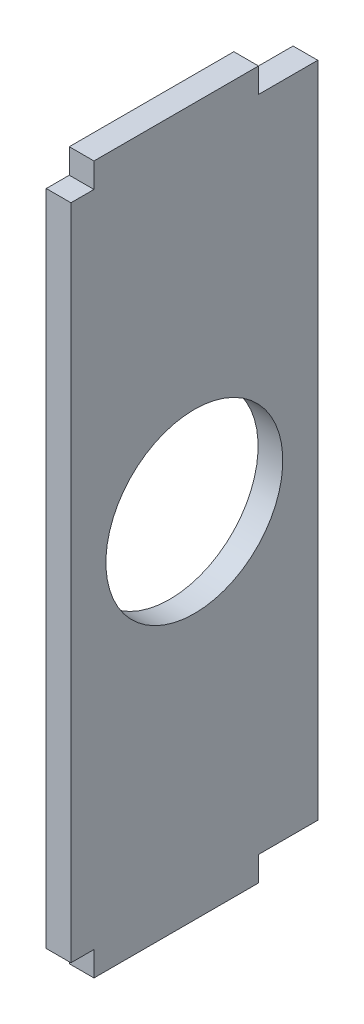
ISO-10303-21;
HEADER;
FILE_DESCRIPTION(('STEP AP214'),'2;1');
FILE_NAME('part.step','',(''),(''),'','','');
FILE_SCHEMA(('AUTOMOTIVE_DESIGN { 1 0 10303 214 1 1 1 1 }'));
ENDSEC;
DATA;
#1=APPLICATION_CONTEXT('core data for automotive mechanical design processes');
#2=APPLICATION_PROTOCOL_DEFINITION('international standard','automotive_design',2000,#1);
#3=PRODUCT_CONTEXT('',#1,'mechanical');
#4=PRODUCT('Part','Part','',(#3));
#5=PRODUCT_RELATED_PRODUCT_CATEGORY('part','',(#4));
#6=PRODUCT_DEFINITION_FORMATION('','',#4);
#7=PRODUCT_DEFINITION_CONTEXT('part definition',#1,'design');
#8=PRODUCT_DEFINITION('design','',#6,#7);
#9=PRODUCT_DEFINITION_SHAPE('','',#8);
#10=(LENGTH_UNIT() NAMED_UNIT(*) SI_UNIT(.MILLI.,.METRE.));
#11=(NAMED_UNIT(*) PLANE_ANGLE_UNIT() SI_UNIT($,.RADIAN.));
#12=(NAMED_UNIT(*) SI_UNIT($,.STERADIAN.) SOLID_ANGLE_UNIT());
#13=UNCERTAINTY_MEASURE_WITH_UNIT(LENGTH_MEASURE(1.E-05),#10,'distance_accuracy_value','');
#14=(GEOMETRIC_REPRESENTATION_CONTEXT(3) GLOBAL_UNCERTAINTY_ASSIGNED_CONTEXT((#13)) GLOBAL_UNIT_ASSIGNED_CONTEXT((#10,
#11,#12)) REPRESENTATION_CONTEXT('',''));
#15=CARTESIAN_POINT('',(0.,0.,0.));
#16=DIRECTION('',(0.,0.,1.));
#17=DIRECTION('',(1.,0.,0.));
#18=AXIS2_PLACEMENT_3D('',#15,#16,#17);
#19=CARTESIAN_POINT('',(0.,-40.,12.2));
#20=DIRECTION('',(0.,-1.,0.));
#21=DIRECTION('',(0.,0.,-1.));
#22=AXIS2_PLACEMENT_3D('',#19,#20,#21);
#23=PLANE('',#22);
#24=DIRECTION('',(0.,0.,1.));
#25=VECTOR('',#24,1.);
#26=CARTESIAN_POINT('',(-3.,-40.,12.2));
#27=LINE('',#26,#25);
#28=CARTESIAN_POINT('',(-3.,-40.,12.2));
#29=VERTEX_POINT('',#28);
#30=CARTESIAN_POINT('',(-3.,-40.,15.));
#31=VERTEX_POINT('',#30);
#32=EDGE_CURVE('E154',#29,#31,#27,.T.);
#33=ORIENTED_EDGE('',*,*,#32,.F.);
#34=DIRECTION('',(-1.,0.,0.));
#35=VECTOR('',#34,1.);
#36=CARTESIAN_POINT('',(0.,-40.,12.2));
#37=LINE('',#36,#35);
#38=CARTESIAN_POINT('',(0.,-40.,12.2));
#39=VERTEX_POINT('',#38);
#40=EDGE_CURVE('E11',#39,#29,#37,.T.);
#41=ORIENTED_EDGE('',*,*,#40,.F.);
#42=DIRECTION('',(0.,0.,1.));
#43=VECTOR('',#42,1.);
#44=CARTESIAN_POINT('',(0.,-40.,12.2));
#45=LINE('',#44,#43);
#46=CARTESIAN_POINT('',(0.,-40.,15.));
#47=VERTEX_POINT('',#46);
#48=EDGE_CURVE('E187',#39,#47,#45,.T.);
#49=ORIENTED_EDGE('',*,*,#48,.T.);
#50=DIRECTION('',(-1.,0.,0.));
#51=VECTOR('',#50,1.);
#52=CARTESIAN_POINT('',(0.,-40.,15.));
#53=LINE('',#52,#51);
#54=EDGE_CURVE('E36',#47,#31,#53,.T.);
#55=ORIENTED_EDGE('',*,*,#54,.T.);
#56=EDGE_LOOP('',(#33,#41,#49,#55));
#57=FACE_BOUND('',#56,.T.);
#58=ADVANCED_FACE('F33',(#57),#23,.T.);
#59=CARTESIAN_POINT('',(0.,-43.,12.2));
#60=DIRECTION('',(0.,0.,1.));
#61=DIRECTION('',(0.,-1.,0.));
#62=AXIS2_PLACEMENT_3D('',#59,#60,#61);
#63=PLANE('',#62);
#64=DIRECTION('',(0.,1.,0.));
#65=VECTOR('',#64,1.);
#66=CARTESIAN_POINT('',(-3.,-43.,12.2));
#67=LINE('',#66,#65);
#68=CARTESIAN_POINT('',(-3.,-43.,12.2));
#69=VERTEX_POINT('',#68);
#70=EDGE_CURVE('E185',#69,#29,#67,.T.);
#71=ORIENTED_EDGE('',*,*,#70,.F.);
#72=DIRECTION('',(-1.,0.,0.));
#73=VECTOR('',#72,1.);
#74=CARTESIAN_POINT('',(0.,-43.,12.2));
#75=LINE('',#74,#73);
#76=CARTESIAN_POINT('',(0.,-43.,12.2));
#77=VERTEX_POINT('',#76);
#78=EDGE_CURVE('E42',#77,#69,#75,.T.);
#79=ORIENTED_EDGE('',*,*,#78,.F.);
#80=DIRECTION('',(0.,1.,0.));
#81=VECTOR('',#80,1.);
#82=CARTESIAN_POINT('',(0.,-43.,12.2));
#83=LINE('',#82,#81);
#84=EDGE_CURVE('E144',#77,#39,#83,.T.);
#85=ORIENTED_EDGE('',*,*,#84,.T.);
#86=ORIENTED_EDGE('',*,*,#40,.T.);
#87=EDGE_LOOP('',(#71,#79,#85,#86));
#88=FACE_BOUND('',#87,.T.);
#89=ADVANCED_FACE('F207',(#88),#63,.T.);
#90=CARTESIAN_POINT('',(0.,-43.,-7.79999999999999));
#91=DIRECTION('',(0.,-1.,0.));
#92=DIRECTION('',(1.,0.,0.));
#93=AXIS2_PLACEMENT_3D('',#90,#91,#92);
#94=PLANE('',#93);
#95=DIRECTION('',(0.,0.,1.));
#96=VECTOR('',#95,1.);
#97=CARTESIAN_POINT('',(-3.,-43.,-7.79999999999999));
#98=LINE('',#97,#96);
#99=CARTESIAN_POINT('',(-3.,-43.,-7.79999999999999));
#100=VERTEX_POINT('',#99);
#101=EDGE_CURVE('E131',#100,#69,#98,.T.);
#102=ORIENTED_EDGE('',*,*,#101,.F.);
#103=DIRECTION('',(-1.,0.,0.));
#104=VECTOR('',#103,1.);
#105=CARTESIAN_POINT('',(0.,-43.,-7.79999999999999));
#106=LINE('',#105,#104);
#107=CARTESIAN_POINT('',(0.,-43.,-7.79999999999999));
#108=VERTEX_POINT('',#107);
#109=EDGE_CURVE('E126',#108,#100,#106,.T.);
#110=ORIENTED_EDGE('',*,*,#109,.F.);
#111=DIRECTION('',(0.,0.,1.));
#112=VECTOR('',#111,1.);
#113=CARTESIAN_POINT('',(0.,-43.,-7.79999999999999));
#114=LINE('',#113,#112);
#115=EDGE_CURVE('E129',#108,#77,#114,.T.);
#116=ORIENTED_EDGE('',*,*,#115,.T.);
#117=ORIENTED_EDGE('',*,*,#78,.T.);
#118=EDGE_LOOP('',(#102,#110,#116,#117));
#119=FACE_BOUND('',#118,.T.);
#120=ADVANCED_FACE('F128',(#119),#94,.T.);
#121=CARTESIAN_POINT('',(0.,-40.,-7.79999999999999));
#122=DIRECTION('',(0.,0.,-1.));
#123=DIRECTION('',(-1.,0.,0.));
#124=AXIS2_PLACEMENT_3D('',#121,#122,#123);
#125=PLANE('',#124);
#126=DIRECTION('',(0.,-1.,0.));
#127=VECTOR('',#126,1.);
#128=CARTESIAN_POINT('',(-3.,-40.,-7.79999999999999));
#129=LINE('',#128,#127);
#130=CARTESIAN_POINT('',(-3.,-40.,-7.79999999999999));
#131=VERTEX_POINT('',#130);
#132=EDGE_CURVE('E182',#131,#100,#129,.T.);
#133=ORIENTED_EDGE('',*,*,#132,.F.);
#134=DIRECTION('',(-1.,0.,0.));
#135=VECTOR('',#134,1.);
#136=CARTESIAN_POINT('',(0.,-40.,-7.79999999999999));
#137=LINE('',#136,#135);
#138=CARTESIAN_POINT('',(0.,-40.,-7.79999999999999));
#139=VERTEX_POINT('',#138);
#140=EDGE_CURVE('E136',#139,#131,#137,.T.);
#141=ORIENTED_EDGE('',*,*,#140,.F.);
#142=DIRECTION('',(0.,-1.,0.));
#143=VECTOR('',#142,1.);
#144=CARTESIAN_POINT('',(0.,-40.,-7.79999999999999));
#145=LINE('',#144,#143);
#146=EDGE_CURVE('E142',#139,#108,#145,.T.);
#147=ORIENTED_EDGE('',*,*,#146,.T.);
#148=ORIENTED_EDGE('',*,*,#109,.T.);
#149=EDGE_LOOP('',(#133,#141,#147,#148));
#150=FACE_BOUND('',#149,.T.);
#151=ADVANCED_FACE('F146',(#150),#125,.T.);
#152=CARTESIAN_POINT('',(0.,-40.,-15.));
#153=DIRECTION('',(0.,-1.,0.));
#154=DIRECTION('',(0.,0.,-1.));
#155=AXIS2_PLACEMENT_3D('',#152,#153,#154);
#156=PLANE('',#155);
#157=DIRECTION('',(0.,0.,1.));
#158=VECTOR('',#157,1.);
#159=CARTESIAN_POINT('',(-3.,-40.,-15.));
#160=LINE('',#159,#158);
#161=CARTESIAN_POINT('',(-3.,-40.,-15.));
#162=VERTEX_POINT('',#161);
#163=EDGE_CURVE('E179',#162,#131,#160,.T.);
#164=ORIENTED_EDGE('',*,*,#163,.F.);
#165=DIRECTION('',(-1.,0.,0.));
#166=VECTOR('',#165,1.);
#167=CARTESIAN_POINT('',(0.,-40.,-15.));
#168=LINE('',#167,#166);
#169=CARTESIAN_POINT('',(0.,-40.,-15.));
#170=VERTEX_POINT('',#169);
#171=EDGE_CURVE('E191',#170,#162,#168,.T.);
#172=ORIENTED_EDGE('',*,*,#171,.F.);
#173=DIRECTION('',(0.,0.,1.));
#174=VECTOR('',#173,1.);
#175=CARTESIAN_POINT('',(0.,-40.,-15.));
#176=LINE('',#175,#174);
#177=EDGE_CURVE('E147',#170,#139,#176,.T.);
#178=ORIENTED_EDGE('',*,*,#177,.T.);
#179=ORIENTED_EDGE('',*,*,#140,.T.);
#180=EDGE_LOOP('',(#164,#172,#178,#179));
#181=FACE_BOUND('',#180,.T.);
#182=ADVANCED_FACE('F220',(#181),#156,.T.);
#183=CARTESIAN_POINT('',(0.,40.,-15.));
#184=DIRECTION('',(0.,0.,-1.));
#185=DIRECTION('',(0.,1.,0.));
#186=AXIS2_PLACEMENT_3D('',#183,#184,#185);
#187=PLANE('',#186);
#188=DIRECTION('',(0.,-1.,0.));
#189=VECTOR('',#188,1.);
#190=CARTESIAN_POINT('',(-3.,40.,-15.));
#191=LINE('',#190,#189);
#192=CARTESIAN_POINT('',(-3.,40.,-15.));
#193=VERTEX_POINT('',#192);
#194=EDGE_CURVE('E176',#193,#162,#191,.T.);
#195=ORIENTED_EDGE('',*,*,#194,.F.);
#196=DIRECTION('',(-1.,0.,0.));
#197=VECTOR('',#196,1.);
#198=CARTESIAN_POINT('',(0.,40.,-15.));
#199=LINE('',#198,#197);
#200=CARTESIAN_POINT('',(0.,40.,-15.));
#201=VERTEX_POINT('',#200);
#202=EDGE_CURVE('E193',#201,#193,#199,.T.);
#203=ORIENTED_EDGE('',*,*,#202,.F.);
#204=DIRECTION('',(0.,-1.,0.));
#205=VECTOR('',#204,1.);
#206=CARTESIAN_POINT('',(0.,40.,-15.));
#207=LINE('',#206,#205);
#208=EDGE_CURVE('E149',#201,#170,#207,.T.);
#209=ORIENTED_EDGE('',*,*,#208,.T.);
#210=ORIENTED_EDGE('',*,*,#171,.T.);
#211=EDGE_LOOP('',(#195,#203,#209,#210));
#212=FACE_BOUND('',#211,.T.);
#213=ADVANCED_FACE('F223',(#212),#187,.T.);
#214=CARTESIAN_POINT('',(0.,40.,-7.79999999999998));
#215=DIRECTION('',(0.,1.,0.));
#216=DIRECTION('',(0.,0.,1.));
#217=AXIS2_PLACEMENT_3D('',#214,#215,#216);
#218=PLANE('',#217);
#219=DIRECTION('',(0.,0.,-1.));
#220=VECTOR('',#219,1.);
#221=CARTESIAN_POINT('',(-3.,40.,-7.79999999999998));
#222=LINE('',#221,#220);
#223=CARTESIAN_POINT('',(-3.,40.,-7.79999999999998));
#224=VERTEX_POINT('',#223);
#225=EDGE_CURVE('E173',#224,#193,#222,.T.);
#226=ORIENTED_EDGE('',*,*,#225,.F.);
#227=DIRECTION('',(-1.,0.,0.));
#228=VECTOR('',#227,1.);
#229=CARTESIAN_POINT('',(0.,40.,-7.79999999999998));
#230=LINE('',#229,#228);
#231=CARTESIAN_POINT('',(0.,40.,-7.79999999999998));
#232=VERTEX_POINT('',#231);
#233=EDGE_CURVE('E195',#232,#224,#230,.T.);
#234=ORIENTED_EDGE('',*,*,#233,.F.);
#235=DIRECTION('',(0.,0.,-1.));
#236=VECTOR('',#235,1.);
#237=CARTESIAN_POINT('',(0.,40.,-7.79999999999998));
#238=LINE('',#237,#236);
#239=EDGE_CURVE('E286',#232,#201,#238,.T.);
#240=ORIENTED_EDGE('',*,*,#239,.T.);
#241=ORIENTED_EDGE('',*,*,#202,.T.);
#242=EDGE_LOOP('',(#226,#234,#240,#241));
#243=FACE_BOUND('',#242,.T.);
#244=ADVANCED_FACE('F227',(#243),#218,.T.);
#245=CARTESIAN_POINT('',(0.,43.,-7.79999999999998));
#246=DIRECTION('',(0.,0.,-1.));
#247=DIRECTION('',(0.,1.,0.));
#248=AXIS2_PLACEMENT_3D('',#245,#246,#247);
#249=PLANE('',#248);
#250=DIRECTION('',(0.,-1.,0.));
#251=VECTOR('',#250,1.);
#252=CARTESIAN_POINT('',(-3.,43.,-7.79999999999998));
#253=LINE('',#252,#251);
#254=CARTESIAN_POINT('',(-3.,43.,-7.79999999999998));
#255=VERTEX_POINT('',#254);
#256=EDGE_CURVE('E170',#255,#224,#253,.T.);
#257=ORIENTED_EDGE('',*,*,#256,.F.);
#258=DIRECTION('',(-1.,0.,0.));
#259=VECTOR('',#258,1.);
#260=CARTESIAN_POINT('',(0.,43.,-7.79999999999998));
#261=LINE('',#260,#259);
#262=CARTESIAN_POINT('',(0.,43.,-7.79999999999998));
#263=VERTEX_POINT('',#262);
#264=EDGE_CURVE('E197',#263,#255,#261,.T.);
#265=ORIENTED_EDGE('',*,*,#264,.F.);
#266=DIRECTION('',(0.,-1.,0.));
#267=VECTOR('',#266,1.);
#268=CARTESIAN_POINT('',(0.,43.,-7.79999999999998));
#269=LINE('',#268,#267);
#270=EDGE_CURVE('E283',#263,#232,#269,.T.);
#271=ORIENTED_EDGE('',*,*,#270,.T.);
#272=ORIENTED_EDGE('',*,*,#233,.T.);
#273=EDGE_LOOP('',(#257,#265,#271,#272));
#274=FACE_BOUND('',#273,.T.);
#275=ADVANCED_FACE('F231',(#274),#249,.T.);
#276=CARTESIAN_POINT('',(0.,43.,12.2));
#277=DIRECTION('',(0.,1.,0.));
#278=DIRECTION('',(-1.,0.,0.));
#279=AXIS2_PLACEMENT_3D('',#276,#277,#278);
#280=PLANE('',#279);
#281=DIRECTION('',(0.,0.,-1.));
#282=VECTOR('',#281,1.);
#283=CARTESIAN_POINT('',(-3.,43.,12.2));
#284=LINE('',#283,#282);
#285=CARTESIAN_POINT('',(-3.,43.,12.2));
#286=VERTEX_POINT('',#285);
#287=EDGE_CURVE('E167',#286,#255,#284,.T.);
#288=ORIENTED_EDGE('',*,*,#287,.F.);
#289=DIRECTION('',(-1.,0.,0.));
#290=VECTOR('',#289,1.);
#291=CARTESIAN_POINT('',(0.,43.,12.2));
#292=LINE('',#291,#290);
#293=CARTESIAN_POINT('',(0.,43.,12.2));
#294=VERTEX_POINT('',#293);
#295=EDGE_CURVE('E199',#294,#286,#292,.T.);
#296=ORIENTED_EDGE('',*,*,#295,.F.);
#297=DIRECTION('',(0.,0.,-1.));
#298=VECTOR('',#297,1.);
#299=CARTESIAN_POINT('',(0.,43.,12.2));
#300=LINE('',#299,#298);
#301=EDGE_CURVE('E280',#294,#263,#300,.T.);
#302=ORIENTED_EDGE('',*,*,#301,.T.);
#303=ORIENTED_EDGE('',*,*,#264,.T.);
#304=EDGE_LOOP('',(#288,#296,#302,#303));
#305=FACE_BOUND('',#304,.T.);
#306=ADVANCED_FACE('F235',(#305),#280,.T.);
#307=CARTESIAN_POINT('',(0.,40.,12.2));
#308=DIRECTION('',(0.,0.,1.));
#309=DIRECTION('',(1.,0.,0.));
#310=AXIS2_PLACEMENT_3D('',#307,#308,#309);
#311=PLANE('',#310);
#312=DIRECTION('',(0.,1.,0.));
#313=VECTOR('',#312,1.);
#314=CARTESIAN_POINT('',(-3.,40.,12.2));
#315=LINE('',#314,#313);
#316=CARTESIAN_POINT('',(-3.,40.,12.2));
#317=VERTEX_POINT('',#316);
#318=EDGE_CURVE('E164',#317,#286,#315,.T.);
#319=ORIENTED_EDGE('',*,*,#318,.F.);
#320=DIRECTION('',(-1.,0.,0.));
#321=VECTOR('',#320,1.);
#322=CARTESIAN_POINT('',(0.,40.,12.2));
#323=LINE('',#322,#321);
#324=CARTESIAN_POINT('',(0.,40.,12.2));
#325=VERTEX_POINT('',#324);
#326=EDGE_CURVE('E201',#325,#317,#323,.T.);
#327=ORIENTED_EDGE('',*,*,#326,.F.);
#328=DIRECTION('',(0.,1.,0.));
#329=VECTOR('',#328,1.);
#330=CARTESIAN_POINT('',(0.,40.,12.2));
#331=LINE('',#330,#329);
#332=EDGE_CURVE('E277',#325,#294,#331,.T.);
#333=ORIENTED_EDGE('',*,*,#332,.T.);
#334=ORIENTED_EDGE('',*,*,#295,.T.);
#335=EDGE_LOOP('',(#319,#327,#333,#334));
#336=FACE_BOUND('',#335,.T.);
#337=ADVANCED_FACE('F239',(#336),#311,.T.);
#338=CARTESIAN_POINT('',(0.,40.,15.));
#339=DIRECTION('',(0.,1.,0.));
#340=DIRECTION('',(0.,0.,1.));
#341=AXIS2_PLACEMENT_3D('',#338,#339,#340);
#342=PLANE('',#341);
#343=DIRECTION('',(0.,0.,-1.));
#344=VECTOR('',#343,1.);
#345=CARTESIAN_POINT('',(-3.,40.,15.));
#346=LINE('',#345,#344);
#347=CARTESIAN_POINT('',(-3.,40.,15.));
#348=VERTEX_POINT('',#347);
#349=EDGE_CURVE('E161',#348,#317,#346,.T.);
#350=ORIENTED_EDGE('',*,*,#349,.F.);
#351=DIRECTION('',(-1.,0.,0.));
#352=VECTOR('',#351,1.);
#353=CARTESIAN_POINT('',(0.,40.,15.));
#354=LINE('',#353,#352);
#355=CARTESIAN_POINT('',(0.,40.,15.));
#356=VERTEX_POINT('',#355);
#357=EDGE_CURVE('E202',#356,#348,#354,.T.);
#358=ORIENTED_EDGE('',*,*,#357,.F.);
#359=DIRECTION('',(0.,0.,-1.));
#360=VECTOR('',#359,1.);
#361=CARTESIAN_POINT('',(0.,40.,15.));
#362=LINE('',#361,#360);
#363=EDGE_CURVE('E274',#356,#325,#362,.T.);
#364=ORIENTED_EDGE('',*,*,#363,.T.);
#365=ORIENTED_EDGE('',*,*,#326,.T.);
#366=EDGE_LOOP('',(#350,#358,#364,#365));
#367=FACE_BOUND('',#366,.T.);
#368=ADVANCED_FACE('F243',(#367),#342,.T.);
#369=CARTESIAN_POINT('',(0.,-40.,15.));
#370=DIRECTION('',(0.,0.,1.));
#371=DIRECTION('',(1.,0.,0.));
#372=AXIS2_PLACEMENT_3D('',#369,#370,#371);
#373=PLANE('',#372);
#374=DIRECTION('',(0.,1.,0.));
#375=VECTOR('',#374,1.);
#376=CARTESIAN_POINT('',(-3.,-40.,15.));
#377=LINE('',#376,#375);
#378=EDGE_CURVE('E157',#31,#348,#377,.T.);
#379=ORIENTED_EDGE('',*,*,#378,.F.);
#380=ORIENTED_EDGE('',*,*,#54,.F.);
#381=DIRECTION('',(0.,1.,0.));
#382=VECTOR('',#381,1.);
#383=CARTESIAN_POINT('',(0.,-40.,15.));
#384=LINE('',#383,#382);
#385=EDGE_CURVE('E272',#47,#356,#384,.T.);
#386=ORIENTED_EDGE('',*,*,#385,.T.);
#387=ORIENTED_EDGE('',*,*,#357,.T.);
#388=EDGE_LOOP('',(#379,#380,#386,#387));
#389=FACE_BOUND('',#388,.T.);
#390=ADVANCED_FACE('F204',(#389),#373,.T.);
#391=CARTESIAN_POINT('',(0.,0.,0.));
#392=DIRECTION('',(-1.,0.,0.));
#393=DIRECTION('',(0.,-1.,0.));
#394=AXIS2_PLACEMENT_3D('',#391,#392,#393);
#395=PLANE('',#394);
#396=CARTESIAN_POINT('',(0.,0.,0.));
#397=DIRECTION('',(-1.,0.,0.));
#398=DIRECTION('',(0.,1.,0.));
#399=AXIS2_PLACEMENT_3D('',#396,#397,#398);
#400=CIRCLE('',#399,10.75);
#401=CARTESIAN_POINT('',(0.,10.75,0.));
#402=VERTEX_POINT('',#401);
#403=EDGE_CURVE('E158',#402,#402,#400,.T.);
#404=ORIENTED_EDGE('',*,*,#403,.T.);
#405=EDGE_LOOP('',(#404));
#406=FACE_BOUND('',#405,.T.);
#407=ORIENTED_EDGE('',*,*,#48,.F.);
#408=ORIENTED_EDGE('',*,*,#84,.F.);
#409=ORIENTED_EDGE('',*,*,#115,.F.);
#410=ORIENTED_EDGE('',*,*,#146,.F.);
#411=ORIENTED_EDGE('',*,*,#177,.F.);
#412=ORIENTED_EDGE('',*,*,#208,.F.);
#413=ORIENTED_EDGE('',*,*,#239,.F.);
#414=ORIENTED_EDGE('',*,*,#270,.F.);
#415=ORIENTED_EDGE('',*,*,#301,.F.);
#416=ORIENTED_EDGE('',*,*,#332,.F.);
#417=ORIENTED_EDGE('',*,*,#363,.F.);
#418=ORIENTED_EDGE('',*,*,#385,.F.);
#419=EDGE_LOOP('',(#407,#408,#409,#410,#411,#412,#413,#414,#415,#416,#417,#418));
#420=FACE_BOUND('',#419,.T.);
#421=ADVANCED_FACE('F140',(#406,#420),#395,.F.);
#422=CARTESIAN_POINT('',(-3.,0.,0.));
#423=DIRECTION('',(-1.,0.,0.));
#424=DIRECTION('',(0.,-1.,0.));
#425=AXIS2_PLACEMENT_3D('',#422,#423,#424);
#426=PLANE('',#425);
#427=CARTESIAN_POINT('',(-3.,0.,0.));
#428=DIRECTION('',(-1.,0.,0.));
#429=DIRECTION('',(0.,1.,0.));
#430=AXIS2_PLACEMENT_3D('',#427,#428,#429);
#431=CIRCLE('',#430,10.75);
#432=CARTESIAN_POINT('',(-3.,10.75,0.));
#433=VERTEX_POINT('',#432);
#434=EDGE_CURVE('E267',#433,#433,#431,.T.);
#435=ORIENTED_EDGE('',*,*,#434,.F.);
#436=EDGE_LOOP('',(#435));
#437=FACE_BOUND('',#436,.T.);
#438=ORIENTED_EDGE('',*,*,#32,.T.);
#439=ORIENTED_EDGE('',*,*,#378,.T.);
#440=ORIENTED_EDGE('',*,*,#349,.T.);
#441=ORIENTED_EDGE('',*,*,#318,.T.);
#442=ORIENTED_EDGE('',*,*,#287,.T.);
#443=ORIENTED_EDGE('',*,*,#256,.T.);
#444=ORIENTED_EDGE('',*,*,#225,.T.);
#445=ORIENTED_EDGE('',*,*,#194,.T.);
#446=ORIENTED_EDGE('',*,*,#163,.T.);
#447=ORIENTED_EDGE('',*,*,#132,.T.);
#448=ORIENTED_EDGE('',*,*,#101,.T.);
#449=ORIENTED_EDGE('',*,*,#70,.T.);
#450=EDGE_LOOP('',(#438,#439,#440,#441,#442,#443,#444,#445,#446,#447,#448,#449));
#451=FACE_BOUND('',#450,.T.);
#452=ADVANCED_FACE('F206',(#437,#451),#426,.T.);
#453=CARTESIAN_POINT('',(0.,0.,0.));
#454=DIRECTION('',(-1.,0.,0.));
#455=DIRECTION('',(0.,-1.,0.));
#456=AXIS2_PLACEMENT_3D('',#453,#454,#455);
#457=CYLINDRICAL_SURFACE('',#456,10.75);
#458=ORIENTED_EDGE('',*,*,#403,.F.);
#459=EDGE_LOOP('',(#458));
#460=FACE_BOUND('',#459,.T.);
#461=ORIENTED_EDGE('',*,*,#434,.T.);
#462=EDGE_LOOP('',(#461));
#463=FACE_BOUND('',#462,.T.);
#464=ADVANCED_FACE('F255',(#460,#463),#457,.F.);
#465=CLOSED_SHELL('',(#58,#89,#120,#151,#182,#213,#244,#275,#306,#337,#368,#390,#421,#452,#464));
#466=MANIFOLD_SOLID_BREP('B2',#465);
#467=ADVANCED_BREP_SHAPE_REPRESENTATION('',(#18,#466),#14);
#468=SHAPE_DEFINITION_REPRESENTATION(#9,#467);
ENDSEC;
END-ISO-10303-21;
